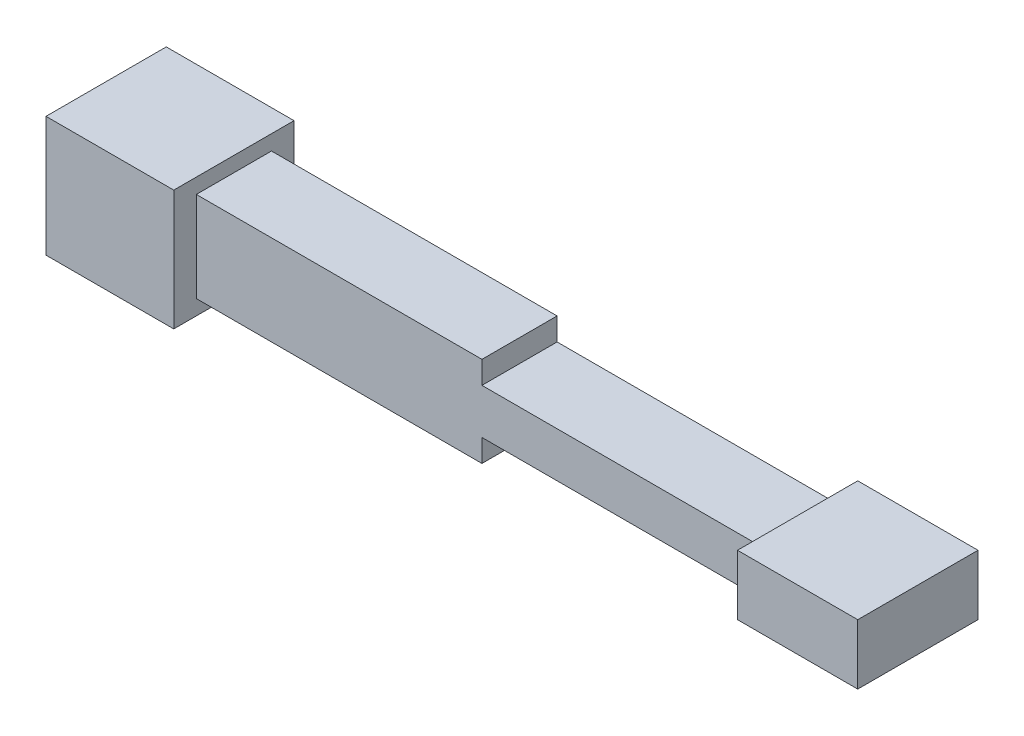
ISO-10303-21;
HEADER;
FILE_DESCRIPTION(('STEP AP214'),'2;1');
FILE_NAME('part.step','',(''),(''),'','','');
FILE_SCHEMA(('AUTOMOTIVE_DESIGN { 1 0 10303 214 1 1 1 1 }'));
ENDSEC;
DATA;
#1=APPLICATION_CONTEXT('core data for automotive mechanical design processes');
#2=APPLICATION_PROTOCOL_DEFINITION('international standard','automotive_design',2000,#1);
#3=PRODUCT_CONTEXT('',#1,'mechanical');
#4=PRODUCT('Part','Part','',(#3));
#5=PRODUCT_RELATED_PRODUCT_CATEGORY('part','',(#4));
#6=PRODUCT_DEFINITION_FORMATION('','',#4);
#7=PRODUCT_DEFINITION_CONTEXT('part definition',#1,'design');
#8=PRODUCT_DEFINITION('design','',#6,#7);
#9=PRODUCT_DEFINITION_SHAPE('','',#8);
#10=(LENGTH_UNIT() NAMED_UNIT(*) SI_UNIT(.MILLI.,.METRE.));
#11=(NAMED_UNIT(*) PLANE_ANGLE_UNIT() SI_UNIT($,.RADIAN.));
#12=(NAMED_UNIT(*) SI_UNIT($,.STERADIAN.) SOLID_ANGLE_UNIT());
#13=UNCERTAINTY_MEASURE_WITH_UNIT(LENGTH_MEASURE(1.E-05),#10,'distance_accuracy_value','');
#14=(GEOMETRIC_REPRESENTATION_CONTEXT(3) GLOBAL_UNCERTAINTY_ASSIGNED_CONTEXT((#13)) GLOBAL_UNIT_ASSIGNED_CONTEXT((#10,
#11,#12)) REPRESENTATION_CONTEXT('',''));
#15=CARTESIAN_POINT('',(0.,0.,0.));
#16=DIRECTION('',(0.,0.,1.));
#17=DIRECTION('',(1.,0.,0.));
#18=AXIS2_PLACEMENT_3D('',#15,#16,#17);
#19=CARTESIAN_POINT('',(-37.,0.,8.));
#20=DIRECTION('',(-1.,0.,0.));
#21=DIRECTION('',(0.,0.,1.));
#22=AXIS2_PLACEMENT_3D('',#19,#20,#21);
#23=PLANE('',#22);
#24=DIRECTION('',(0.,1.,0.));
#25=VECTOR('',#24,1.);
#26=CARTESIAN_POINT('',(-37.,0.,-8.));
#27=LINE('',#26,#25);
#28=CARTESIAN_POINT('',(-37.,-8.,-8.));
#29=VERTEX_POINT('',#28);
#30=CARTESIAN_POINT('',(-37.,8.00000000000001,-8.));
#31=VERTEX_POINT('',#30);
#32=EDGE_CURVE('E279',#29,#31,#27,.T.);
#33=ORIENTED_EDGE('',*,*,#32,.T.);
#34=DIRECTION('',(0.,0.,-1.));
#35=VECTOR('',#34,1.);
#36=CARTESIAN_POINT('',(-37.,8.00000000000001,8.));
#37=LINE('',#36,#35);
#38=CARTESIAN_POINT('',(-37.,8.00000000000001,8.));
#39=VERTEX_POINT('',#38);
#40=EDGE_CURVE('E55',#39,#31,#37,.T.);
#41=ORIENTED_EDGE('',*,*,#40,.F.);
#42=DIRECTION('',(0.,1.,0.));
#43=VECTOR('',#42,1.);
#44=CARTESIAN_POINT('',(-37.,0.,8.));
#45=LINE('',#44,#43);
#46=CARTESIAN_POINT('',(-37.,-8.,8.));
#47=VERTEX_POINT('',#46);
#48=EDGE_CURVE('E97',#47,#39,#45,.T.);
#49=ORIENTED_EDGE('',*,*,#48,.F.);
#50=DIRECTION('',(0.,0.,-1.));
#51=VECTOR('',#50,1.);
#52=CARTESIAN_POINT('',(-37.,-8.,8.));
#53=LINE('',#52,#51);
#54=EDGE_CURVE('E11',#47,#29,#53,.T.);
#55=ORIENTED_EDGE('',*,*,#54,.T.);
#56=EDGE_LOOP('',(#33,#41,#49,#55));
#57=FACE_BOUND('',#56,.T.);
#58=DIRECTION('',(0.,1.,0.));
#59=VECTOR('',#58,1.);
#60=CARTESIAN_POINT('',(-37.,0.,-5.));
#61=LINE('',#60,#59);
#62=CARTESIAN_POINT('',(-37.,-6.,-5.));
#63=VERTEX_POINT('',#62);
#64=CARTESIAN_POINT('',(-37.,6.,-5.));
#65=VERTEX_POINT('',#64);
#66=EDGE_CURVE('E62',#63,#65,#61,.T.);
#67=ORIENTED_EDGE('',*,*,#66,.F.);
#68=DIRECTION('',(0.,0.,-1.));
#69=VECTOR('',#68,1.);
#70=CARTESIAN_POINT('',(-37.,-6.,5.));
#71=LINE('',#70,#69);
#72=CARTESIAN_POINT('',(-37.,-6.,5.));
#73=VERTEX_POINT('',#72);
#74=EDGE_CURVE('E231',#73,#63,#71,.T.);
#75=ORIENTED_EDGE('',*,*,#74,.F.);
#76=DIRECTION('',(0.,1.,0.));
#77=VECTOR('',#76,1.);
#78=CARTESIAN_POINT('',(-37.,0.,5.));
#79=LINE('',#78,#77);
#80=CARTESIAN_POINT('',(-37.,6.,5.));
#81=VERTEX_POINT('',#80);
#82=EDGE_CURVE('E228',#73,#81,#79,.T.);
#83=ORIENTED_EDGE('',*,*,#82,.T.);
#84=DIRECTION('',(0.,0.,-1.));
#85=VECTOR('',#84,1.);
#86=CARTESIAN_POINT('',(-37.,6.,5.));
#87=LINE('',#86,#85);
#88=EDGE_CURVE('E250',#81,#65,#87,.T.);
#89=ORIENTED_EDGE('',*,*,#88,.T.);
#90=EDGE_LOOP('',(#67,#75,#83,#89));
#91=FACE_BOUND('',#90,.T.);
#92=ADVANCED_FACE('F47',(#57,#91),#23,.F.);
#93=CARTESIAN_POINT('',(0.,-8.00000000000001,8.));
#94=DIRECTION('',(0.,1.,0.));
#95=DIRECTION('',(-1.,0.,0.));
#96=AXIS2_PLACEMENT_3D('',#93,#94,#95);
#97=PLANE('',#96);
#98=DIRECTION('',(1.,0.,0.));
#99=VECTOR('',#98,1.);
#100=CARTESIAN_POINT('',(0.,-8.00000000000001,-8.));
#101=LINE('',#100,#99);
#102=CARTESIAN_POINT('',(-54.,-8.,-8.));
#103=VERTEX_POINT('',#102);
#104=EDGE_CURVE('E268',#103,#29,#101,.T.);
#105=ORIENTED_EDGE('',*,*,#104,.T.);
#106=ORIENTED_EDGE('',*,*,#54,.F.);
#107=DIRECTION('',(1.,0.,0.));
#108=VECTOR('',#107,1.);
#109=CARTESIAN_POINT('',(0.,-8.00000000000001,8.));
#110=LINE('',#109,#108);
#111=CARTESIAN_POINT('',(-54.,-8.,8.));
#112=VERTEX_POINT('',#111);
#113=EDGE_CURVE('E269',#112,#47,#110,.T.);
#114=ORIENTED_EDGE('',*,*,#113,.F.);
#115=DIRECTION('',(0.,0.,-1.));
#116=VECTOR('',#115,1.);
#117=CARTESIAN_POINT('',(-54.,-8.,8.));
#118=LINE('',#117,#116);
#119=EDGE_CURVE('E71',#112,#103,#118,.T.);
#120=ORIENTED_EDGE('',*,*,#119,.T.);
#121=EDGE_LOOP('',(#105,#106,#114,#120));
#122=FACE_BOUND('',#121,.T.);
#123=ADVANCED_FACE('F49',(#122),#97,.F.);
#124=CARTESIAN_POINT('',(0.,8.00000000000003,8.));
#125=DIRECTION('',(0.,1.,0.));
#126=DIRECTION('',(-1.,0.,0.));
#127=AXIS2_PLACEMENT_3D('',#124,#125,#126);
#128=PLANE('',#127);
#129=DIRECTION('',(1.,0.,0.));
#130=VECTOR('',#129,1.);
#131=CARTESIAN_POINT('',(0.,8.00000000000003,-8.));
#132=LINE('',#131,#130);
#133=CARTESIAN_POINT('',(-54.,8.,-8.));
#134=VERTEX_POINT('',#133);
#135=EDGE_CURVE('E282',#134,#31,#132,.T.);
#136=ORIENTED_EDGE('',*,*,#135,.F.);
#137=DIRECTION('',(0.,0.,-1.));
#138=VECTOR('',#137,1.);
#139=CARTESIAN_POINT('',(-54.,8.,8.));
#140=LINE('',#139,#138);
#141=CARTESIAN_POINT('',(-54.,8.,8.));
#142=VERTEX_POINT('',#141);
#143=EDGE_CURVE('E288',#142,#134,#140,.T.);
#144=ORIENTED_EDGE('',*,*,#143,.F.);
#145=DIRECTION('',(1.,0.,0.));
#146=VECTOR('',#145,1.);
#147=CARTESIAN_POINT('',(0.,8.00000000000003,8.));
#148=LINE('',#147,#146);
#149=EDGE_CURVE('E273',#142,#39,#148,.T.);
#150=ORIENTED_EDGE('',*,*,#149,.T.);
#151=ORIENTED_EDGE('',*,*,#40,.T.);
#152=EDGE_LOOP('',(#136,#144,#150,#151));
#153=FACE_BOUND('',#152,.T.);
#154=ADVANCED_FACE('F291',(#153),#128,.T.);
#155=CARTESIAN_POINT('',(-54.,0.,8.));
#156=DIRECTION('',(-1.,0.,0.));
#157=DIRECTION('',(0.,0.,1.));
#158=AXIS2_PLACEMENT_3D('',#155,#156,#157);
#159=PLANE('',#158);
#160=DIRECTION('',(0.,1.,0.));
#161=VECTOR('',#160,1.);
#162=CARTESIAN_POINT('',(-54.,0.,-8.));
#163=LINE('',#162,#161);
#164=EDGE_CURVE('E271',#103,#134,#163,.T.);
#165=ORIENTED_EDGE('',*,*,#164,.F.);
#166=ORIENTED_EDGE('',*,*,#119,.F.);
#167=DIRECTION('',(0.,1.,0.));
#168=VECTOR('',#167,1.);
#169=CARTESIAN_POINT('',(-54.,0.,8.));
#170=LINE('',#169,#168);
#171=EDGE_CURVE('E276',#112,#142,#170,.T.);
#172=ORIENTED_EDGE('',*,*,#171,.T.);
#173=ORIENTED_EDGE('',*,*,#143,.T.);
#174=EDGE_LOOP('',(#165,#166,#172,#173));
#175=FACE_BOUND('',#174,.T.);
#176=ADVANCED_FACE('F297',(#175),#159,.T.);
#177=CARTESIAN_POINT('',(0.,0.,8.));
#178=DIRECTION('',(0.,0.,1.));
#179=DIRECTION('',(1.,0.,0.));
#180=AXIS2_PLACEMENT_3D('',#177,#178,#179);
#181=PLANE('',#180);
#182=ORIENTED_EDGE('',*,*,#113,.T.);
#183=ORIENTED_EDGE('',*,*,#48,.T.);
#184=ORIENTED_EDGE('',*,*,#149,.F.);
#185=ORIENTED_EDGE('',*,*,#171,.F.);
#186=EDGE_LOOP('',(#182,#183,#184,#185));
#187=FACE_BOUND('',#186,.T.);
#188=ADVANCED_FACE('F300',(#187),#181,.T.);
#189=CARTESIAN_POINT('',(0.,0.,-8.));
#190=DIRECTION('',(0.,0.,1.));
#191=DIRECTION('',(1.,0.,0.));
#192=AXIS2_PLACEMENT_3D('',#189,#190,#191);
#193=PLANE('',#192);
#194=ORIENTED_EDGE('',*,*,#104,.F.);
#195=ORIENTED_EDGE('',*,*,#164,.T.);
#196=ORIENTED_EDGE('',*,*,#135,.T.);
#197=ORIENTED_EDGE('',*,*,#32,.F.);
#198=EDGE_LOOP('',(#194,#195,#196,#197));
#199=FACE_BOUND('',#198,.T.);
#200=ADVANCED_FACE('F296',(#199),#193,.F.);
#201=CARTESIAN_POINT('',(0.,-6.,5.));
#202=DIRECTION('',(0.,1.,0.));
#203=DIRECTION('',(-1.,0.,0.));
#204=AXIS2_PLACEMENT_3D('',#201,#202,#203);
#205=PLANE('',#204);
#206=DIRECTION('',(1.,0.,0.));
#207=VECTOR('',#206,1.);
#208=CARTESIAN_POINT('',(0.,-6.,-5.));
#209=LINE('',#208,#207);
#210=CARTESIAN_POINT('',(1.00000000000001,-6.,-5.));
#211=VERTEX_POINT('',#210);
#212=EDGE_CURVE('E180',#63,#211,#209,.T.);
#213=ORIENTED_EDGE('',*,*,#212,.T.);
#214=DIRECTION('',(0.,0.,-1.));
#215=VECTOR('',#214,1.);
#216=CARTESIAN_POINT('',(1.00000000000001,-6.,5.));
#217=LINE('',#216,#215);
#218=CARTESIAN_POINT('',(1.00000000000001,-6.,5.));
#219=VERTEX_POINT('',#218);
#220=EDGE_CURVE('E265',#219,#211,#217,.T.);
#221=ORIENTED_EDGE('',*,*,#220,.F.);
#222=DIRECTION('',(1.,0.,0.));
#223=VECTOR('',#222,1.);
#224=CARTESIAN_POINT('',(0.,-6.,5.));
#225=LINE('',#224,#223);
#226=EDGE_CURVE('E212',#73,#219,#225,.T.);
#227=ORIENTED_EDGE('',*,*,#226,.F.);
#228=ORIENTED_EDGE('',*,*,#74,.T.);
#229=EDGE_LOOP('',(#213,#221,#227,#228));
#230=FACE_BOUND('',#229,.T.);
#231=ADVANCED_FACE('F314',(#230),#205,.F.);
#232=CARTESIAN_POINT('',(1.00000000000001,0.,5.));
#233=DIRECTION('',(-1.,0.,0.));
#234=DIRECTION('',(0.,-1.,0.));
#235=AXIS2_PLACEMENT_3D('',#232,#233,#234);
#236=PLANE('',#235);
#237=DIRECTION('',(0.,1.,0.));
#238=VECTOR('',#237,1.);
#239=CARTESIAN_POINT('',(1.00000000000001,0.,-5.));
#240=LINE('',#239,#238);
#241=CARTESIAN_POINT('',(1.00000000000001,-3.,-5.));
#242=VERTEX_POINT('',#241);
#243=EDGE_CURVE('E234',#211,#242,#240,.T.);
#244=ORIENTED_EDGE('',*,*,#243,.T.);
#245=DIRECTION('',(0.,0.,-1.));
#246=VECTOR('',#245,1.);
#247=CARTESIAN_POINT('',(1.00000000000001,-3.,5.));
#248=LINE('',#247,#246);
#249=CARTESIAN_POINT('',(1.00000000000001,-3.,5.));
#250=VERTEX_POINT('',#249);
#251=EDGE_CURVE('E262',#250,#242,#248,.T.);
#252=ORIENTED_EDGE('',*,*,#251,.F.);
#253=DIRECTION('',(0.,1.,0.));
#254=VECTOR('',#253,1.);
#255=CARTESIAN_POINT('',(1.00000000000001,0.,5.));
#256=LINE('',#255,#254);
#257=EDGE_CURVE('E215',#219,#250,#256,.T.);
#258=ORIENTED_EDGE('',*,*,#257,.F.);
#259=ORIENTED_EDGE('',*,*,#220,.T.);
#260=EDGE_LOOP('',(#244,#252,#258,#259));
#261=FACE_BOUND('',#260,.T.);
#262=ADVANCED_FACE('F319',(#261),#236,.F.);
#263=CARTESIAN_POINT('',(0.,-3.,5.));
#264=DIRECTION('',(0.,1.,0.));
#265=DIRECTION('',(-1.,0.,0.));
#266=AXIS2_PLACEMENT_3D('',#263,#264,#265);
#267=PLANE('',#266);
#268=DIRECTION('',(1.,0.,0.));
#269=VECTOR('',#268,1.);
#270=CARTESIAN_POINT('',(0.,-3.,-5.));
#271=LINE('',#270,#269);
#272=CARTESIAN_POINT('',(38.,-3.,-5.));
#273=VERTEX_POINT('',#272);
#274=EDGE_CURVE('E236',#242,#273,#271,.T.);
#275=ORIENTED_EDGE('',*,*,#274,.T.);
#276=DIRECTION('',(0.,0.,-1.));
#277=VECTOR('',#276,1.);
#278=CARTESIAN_POINT('',(38.,-3.,5.));
#279=LINE('',#278,#277);
#280=CARTESIAN_POINT('',(38.,-3.,5.));
#281=VERTEX_POINT('',#280);
#282=EDGE_CURVE('E259',#281,#273,#279,.T.);
#283=ORIENTED_EDGE('',*,*,#282,.F.);
#284=DIRECTION('',(1.,0.,0.));
#285=VECTOR('',#284,1.);
#286=CARTESIAN_POINT('',(0.,-3.,5.));
#287=LINE('',#286,#285);
#288=EDGE_CURVE('E217',#250,#281,#287,.T.);
#289=ORIENTED_EDGE('',*,*,#288,.F.);
#290=ORIENTED_EDGE('',*,*,#251,.T.);
#291=EDGE_LOOP('',(#275,#283,#289,#290));
#292=FACE_BOUND('',#291,.T.);
#293=ADVANCED_FACE('F321',(#292),#267,.F.);
#294=CARTESIAN_POINT('',(0.,3.,5.));
#295=DIRECTION('',(0.,1.,0.));
#296=DIRECTION('',(-1.,0.,0.));
#297=AXIS2_PLACEMENT_3D('',#294,#295,#296);
#298=PLANE('',#297);
#299=DIRECTION('',(1.,0.,0.));
#300=VECTOR('',#299,1.);
#301=CARTESIAN_POINT('',(0.,3.,-5.));
#302=LINE('',#301,#300);
#303=CARTESIAN_POINT('',(1.00000000000001,3.,-5.));
#304=VERTEX_POINT('',#303);
#305=CARTESIAN_POINT('',(38.,3.,-5.));
#306=VERTEX_POINT('',#305);
#307=EDGE_CURVE('E243',#304,#306,#302,.T.);
#308=ORIENTED_EDGE('',*,*,#307,.F.);
#309=DIRECTION('',(0.,0.,-1.));
#310=VECTOR('',#309,1.);
#311=CARTESIAN_POINT('',(1.00000000000001,3.,5.));
#312=LINE('',#311,#310);
#313=CARTESIAN_POINT('',(1.00000000000001,3.,5.));
#314=VERTEX_POINT('',#313);
#315=EDGE_CURVE('E255',#314,#304,#312,.T.);
#316=ORIENTED_EDGE('',*,*,#315,.F.);
#317=DIRECTION('',(1.,0.,0.));
#318=VECTOR('',#317,1.);
#319=CARTESIAN_POINT('',(0.,3.,5.));
#320=LINE('',#319,#318);
#321=CARTESIAN_POINT('',(38.,3.,5.));
#322=VERTEX_POINT('',#321);
#323=EDGE_CURVE('E222',#314,#322,#320,.T.);
#324=ORIENTED_EDGE('',*,*,#323,.T.);
#325=DIRECTION('',(0.,0.,-1.));
#326=VECTOR('',#325,1.);
#327=CARTESIAN_POINT('',(38.,3.,5.));
#328=LINE('',#327,#326);
#329=EDGE_CURVE('E257',#322,#306,#328,.T.);
#330=ORIENTED_EDGE('',*,*,#329,.T.);
#331=EDGE_LOOP('',(#308,#316,#324,#330));
#332=FACE_BOUND('',#331,.T.);
#333=ADVANCED_FACE('F324',(#332),#298,.T.);
#334=CARTESIAN_POINT('',(1.,6.,-5.));
#335=VERTEX_POINT('',#334);
#336=EDGE_CURVE('E237',#304,#335,#240,.T.);
#337=ORIENTED_EDGE('',*,*,#336,.T.);
#338=DIRECTION('',(0.,0.,-1.));
#339=VECTOR('',#338,1.);
#340=CARTESIAN_POINT('',(1.,6.,5.));
#341=LINE('',#340,#339);
#342=CARTESIAN_POINT('',(1.,6.,5.));
#343=VERTEX_POINT('',#342);
#344=EDGE_CURVE('E253',#343,#335,#341,.T.);
#345=ORIENTED_EDGE('',*,*,#344,.F.);
#346=EDGE_CURVE('E218',#314,#343,#256,.T.);
#347=ORIENTED_EDGE('',*,*,#346,.F.);
#348=ORIENTED_EDGE('',*,*,#315,.T.);
#349=EDGE_LOOP('',(#337,#345,#347,#348));
#350=FACE_BOUND('',#349,.T.);
#351=ADVANCED_FACE('F328',(#350),#236,.F.);
#352=CARTESIAN_POINT('',(0.,6.,5.));
#353=DIRECTION('',(0.,1.,0.));
#354=DIRECTION('',(-1.,0.,0.));
#355=AXIS2_PLACEMENT_3D('',#352,#353,#354);
#356=PLANE('',#355);
#357=DIRECTION('',(1.,0.,0.));
#358=VECTOR('',#357,1.);
#359=CARTESIAN_POINT('',(0.,6.,-5.));
#360=LINE('',#359,#358);
#361=EDGE_CURVE('E246',#65,#335,#360,.T.);
#362=ORIENTED_EDGE('',*,*,#361,.F.);
#363=ORIENTED_EDGE('',*,*,#88,.F.);
#364=DIRECTION('',(1.,0.,0.));
#365=VECTOR('',#364,1.);
#366=CARTESIAN_POINT('',(0.,6.,5.));
#367=LINE('',#366,#365);
#368=EDGE_CURVE('E225',#81,#343,#367,.T.);
#369=ORIENTED_EDGE('',*,*,#368,.T.);
#370=ORIENTED_EDGE('',*,*,#344,.T.);
#371=EDGE_LOOP('',(#362,#363,#369,#370));
#372=FACE_BOUND('',#371,.T.);
#373=ADVANCED_FACE('F332',(#372),#356,.T.);
#374=CARTESIAN_POINT('',(0.,0.,5.));
#375=DIRECTION('',(0.,0.,1.));
#376=DIRECTION('',(1.,0.,0.));
#377=AXIS2_PLACEMENT_3D('',#374,#375,#376);
#378=PLANE('',#377);
#379=ORIENTED_EDGE('',*,*,#226,.T.);
#380=ORIENTED_EDGE('',*,*,#257,.T.);
#381=ORIENTED_EDGE('',*,*,#288,.T.);
#382=DIRECTION('',(0.,1.,0.));
#383=VECTOR('',#382,1.);
#384=CARTESIAN_POINT('',(38.,0.,5.));
#385=LINE('',#384,#383);
#386=EDGE_CURVE('E220',#281,#322,#385,.T.);
#387=ORIENTED_EDGE('',*,*,#386,.T.);
#388=ORIENTED_EDGE('',*,*,#323,.F.);
#389=ORIENTED_EDGE('',*,*,#346,.T.);
#390=ORIENTED_EDGE('',*,*,#368,.F.);
#391=ORIENTED_EDGE('',*,*,#82,.F.);
#392=EDGE_LOOP('',(#379,#380,#381,#387,#388,#389,#390,#391));
#393=FACE_BOUND('',#392,.T.);
#394=ADVANCED_FACE('F336',(#393),#378,.T.);
#395=CARTESIAN_POINT('',(0.,0.,-5.));
#396=DIRECTION('',(0.,0.,1.));
#397=DIRECTION('',(1.,0.,0.));
#398=AXIS2_PLACEMENT_3D('',#395,#396,#397);
#399=PLANE('',#398);
#400=ORIENTED_EDGE('',*,*,#212,.F.);
#401=ORIENTED_EDGE('',*,*,#66,.T.);
#402=ORIENTED_EDGE('',*,*,#361,.T.);
#403=ORIENTED_EDGE('',*,*,#336,.F.);
#404=ORIENTED_EDGE('',*,*,#307,.T.);
#405=DIRECTION('',(0.,1.,0.));
#406=VECTOR('',#405,1.);
#407=CARTESIAN_POINT('',(38.,0.,-5.));
#408=LINE('',#407,#406);
#409=EDGE_CURVE('E240',#273,#306,#408,.T.);
#410=ORIENTED_EDGE('',*,*,#409,.F.);
#411=ORIENTED_EDGE('',*,*,#274,.F.);
#412=ORIENTED_EDGE('',*,*,#243,.F.);
#413=EDGE_LOOP('',(#400,#401,#402,#403,#404,#410,#411,#412));
#414=FACE_BOUND('',#413,.T.);
#415=ADVANCED_FACE('F338',(#414),#399,.F.);
#416=CARTESIAN_POINT('',(38.,0.,8.));
#417=DIRECTION('',(-1.,0.,0.));
#418=DIRECTION('',(0.,0.,1.));
#419=AXIS2_PLACEMENT_3D('',#416,#417,#418);
#420=PLANE('',#419);
#421=ORIENTED_EDGE('',*,*,#282,.T.);
#422=ORIENTED_EDGE('',*,*,#409,.T.);
#423=ORIENTED_EDGE('',*,*,#329,.F.);
#424=ORIENTED_EDGE('',*,*,#386,.F.);
#425=EDGE_LOOP('',(#421,#422,#423,#424));
#426=FACE_BOUND('',#425,.T.);
#427=DIRECTION('',(0.,1.,0.));
#428=VECTOR('',#427,1.);
#429=CARTESIAN_POINT('',(38.,0.,-8.));
#430=LINE('',#429,#428);
#431=CARTESIAN_POINT('',(38.,-4.00000000000001,-8.));
#432=VERTEX_POINT('',#431);
#433=CARTESIAN_POINT('',(38.,3.99999999999998,-8.));
#434=VERTEX_POINT('',#433);
#435=EDGE_CURVE('E175',#432,#434,#430,.T.);
#436=ORIENTED_EDGE('',*,*,#435,.F.);
#437=DIRECTION('',(0.,0.,-1.));
#438=VECTOR('',#437,1.);
#439=CARTESIAN_POINT('',(38.,-4.00000000000001,8.));
#440=LINE('',#439,#438);
#441=CARTESIAN_POINT('',(38.,-4.00000000000001,8.));
#442=VERTEX_POINT('',#441);
#443=EDGE_CURVE('E170',#442,#432,#440,.T.);
#444=ORIENTED_EDGE('',*,*,#443,.F.);
#445=DIRECTION('',(0.,1.,0.));
#446=VECTOR('',#445,1.);
#447=CARTESIAN_POINT('',(38.,0.,8.));
#448=LINE('',#447,#446);
#449=CARTESIAN_POINT('',(38.,3.99999999999998,8.));
#450=VERTEX_POINT('',#449);
#451=EDGE_CURVE('E173',#442,#450,#448,.T.);
#452=ORIENTED_EDGE('',*,*,#451,.T.);
#453=DIRECTION('',(0.,0.,-1.));
#454=VECTOR('',#453,1.);
#455=CARTESIAN_POINT('',(38.,3.99999999999998,8.));
#456=LINE('',#455,#454);
#457=EDGE_CURVE('E199',#450,#434,#456,.T.);
#458=ORIENTED_EDGE('',*,*,#457,.T.);
#459=EDGE_LOOP('',(#436,#444,#452,#458));
#460=FACE_BOUND('',#459,.T.);
#461=ADVANCED_FACE('F172',(#426,#460),#420,.T.);
#462=CARTESIAN_POINT('',(0.,-4.00000000000002,8.));
#463=DIRECTION('',(0.,-1.,0.));
#464=DIRECTION('',(1.,0.,0.));
#465=AXIS2_PLACEMENT_3D('',#462,#463,#464);
#466=PLANE('',#465);
#467=DIRECTION('',(-1.,0.,0.));
#468=VECTOR('',#467,1.);
#469=CARTESIAN_POINT('',(0.,-4.00000000000002,-8.));
#470=LINE('',#469,#468);
#471=CARTESIAN_POINT('',(54.,-4.00000000000001,-8.));
#472=VERTEX_POINT('',#471);
#473=EDGE_CURVE('E201',#472,#432,#470,.T.);
#474=ORIENTED_EDGE('',*,*,#473,.F.);
#475=DIRECTION('',(0.,0.,-1.));
#476=VECTOR('',#475,1.);
#477=CARTESIAN_POINT('',(54.,-4.00000000000001,8.));
#478=LINE('',#477,#476);
#479=CARTESIAN_POINT('',(54.,-4.00000000000001,8.));
#480=VERTEX_POINT('',#479);
#481=EDGE_CURVE('E181',#480,#472,#478,.T.);
#482=ORIENTED_EDGE('',*,*,#481,.F.);
#483=DIRECTION('',(-1.,0.,0.));
#484=VECTOR('',#483,1.);
#485=CARTESIAN_POINT('',(0.,-4.00000000000002,8.));
#486=LINE('',#485,#484);
#487=EDGE_CURVE('E186',#480,#442,#486,.T.);
#488=ORIENTED_EDGE('',*,*,#487,.T.);
#489=ORIENTED_EDGE('',*,*,#443,.T.);
#490=EDGE_LOOP('',(#474,#482,#488,#489));
#491=FACE_BOUND('',#490,.T.);
#492=ADVANCED_FACE('F192',(#491),#466,.T.);
#493=CARTESIAN_POINT('',(54.,0.,8.));
#494=DIRECTION('',(-1.,0.,0.));
#495=DIRECTION('',(0.,0.,1.));
#496=AXIS2_PLACEMENT_3D('',#493,#494,#495);
#497=PLANE('',#496);
#498=DIRECTION('',(0.,1.,0.));
#499=VECTOR('',#498,1.);
#500=CARTESIAN_POINT('',(54.,0.,-8.));
#501=LINE('',#500,#499);
#502=CARTESIAN_POINT('',(54.,3.99999999999999,-8.));
#503=VERTEX_POINT('',#502);
#504=EDGE_CURVE('E203',#472,#503,#501,.T.);
#505=ORIENTED_EDGE('',*,*,#504,.T.);
#506=DIRECTION('',(0.,0.,-1.));
#507=VECTOR('',#506,1.);
#508=CARTESIAN_POINT('',(54.,3.99999999999999,8.));
#509=LINE('',#508,#507);
#510=CARTESIAN_POINT('',(54.,3.99999999999999,8.));
#511=VERTEX_POINT('',#510);
#512=EDGE_CURVE('E208',#511,#503,#509,.T.);
#513=ORIENTED_EDGE('',*,*,#512,.F.);
#514=DIRECTION('',(0.,1.,0.));
#515=VECTOR('',#514,1.);
#516=CARTESIAN_POINT('',(54.,0.,8.));
#517=LINE('',#516,#515);
#518=EDGE_CURVE('E194',#480,#511,#517,.T.);
#519=ORIENTED_EDGE('',*,*,#518,.F.);
#520=ORIENTED_EDGE('',*,*,#481,.T.);
#521=EDGE_LOOP('',(#505,#513,#519,#520));
#522=FACE_BOUND('',#521,.T.);
#523=ADVANCED_FACE('F349',(#522),#497,.F.);
#524=CARTESIAN_POINT('',(0.,3.99999999999997,8.));
#525=DIRECTION('',(0.,-1.,0.));
#526=DIRECTION('',(1.,0.,0.));
#527=AXIS2_PLACEMENT_3D('',#524,#525,#526);
#528=PLANE('',#527);
#529=DIRECTION('',(-1.,0.,0.));
#530=VECTOR('',#529,1.);
#531=CARTESIAN_POINT('',(0.,3.99999999999997,-8.));
#532=LINE('',#531,#530);
#533=EDGE_CURVE('E190',#503,#434,#532,.T.);
#534=ORIENTED_EDGE('',*,*,#533,.T.);
#535=ORIENTED_EDGE('',*,*,#457,.F.);
#536=DIRECTION('',(-1.,0.,0.));
#537=VECTOR('',#536,1.);
#538=CARTESIAN_POINT('',(0.,3.99999999999997,8.));
#539=LINE('',#538,#537);
#540=EDGE_CURVE('E188',#511,#450,#539,.T.);
#541=ORIENTED_EDGE('',*,*,#540,.F.);
#542=ORIENTED_EDGE('',*,*,#512,.T.);
#543=EDGE_LOOP('',(#534,#535,#541,#542));
#544=FACE_BOUND('',#543,.T.);
#545=ADVANCED_FACE('F352',(#544),#528,.F.);
#546=CARTESIAN_POINT('',(0.,0.,8.));
#547=DIRECTION('',(0.,0.,1.));
#548=DIRECTION('',(1.,0.,0.));
#549=AXIS2_PLACEMENT_3D('',#546,#547,#548);
#550=PLANE('',#549);
#551=ORIENTED_EDGE('',*,*,#451,.F.);
#552=ORIENTED_EDGE('',*,*,#487,.F.);
#553=ORIENTED_EDGE('',*,*,#518,.T.);
#554=ORIENTED_EDGE('',*,*,#540,.T.);
#555=EDGE_LOOP('',(#551,#552,#553,#554));
#556=FACE_BOUND('',#555,.T.);
#557=ADVANCED_FACE('F185',(#556),#550,.T.);
#558=CARTESIAN_POINT('',(0.,0.,-8.));
#559=DIRECTION('',(0.,0.,1.));
#560=DIRECTION('',(1.,0.,0.));
#561=AXIS2_PLACEMENT_3D('',#558,#559,#560);
#562=PLANE('',#561);
#563=ORIENTED_EDGE('',*,*,#435,.T.);
#564=ORIENTED_EDGE('',*,*,#533,.F.);
#565=ORIENTED_EDGE('',*,*,#504,.F.);
#566=ORIENTED_EDGE('',*,*,#473,.T.);
#567=EDGE_LOOP('',(#563,#564,#565,#566));
#568=FACE_BOUND('',#567,.T.);
#569=ADVANCED_FACE('F357',(#568),#562,.F.);
#570=CLOSED_SHELL('',(#92,#123,#154,#176,#188,#200,#231,#262,#293,#333,#351,#373,#394,#415,#461,
#492,#523,#545,#557,#569));
#571=MANIFOLD_SOLID_BREP('B2',#570);
#572=ADVANCED_BREP_SHAPE_REPRESENTATION('',(#18,#571),#14);
#573=SHAPE_DEFINITION_REPRESENTATION(#9,#572);
ENDSEC;
END-ISO-10303-21;
